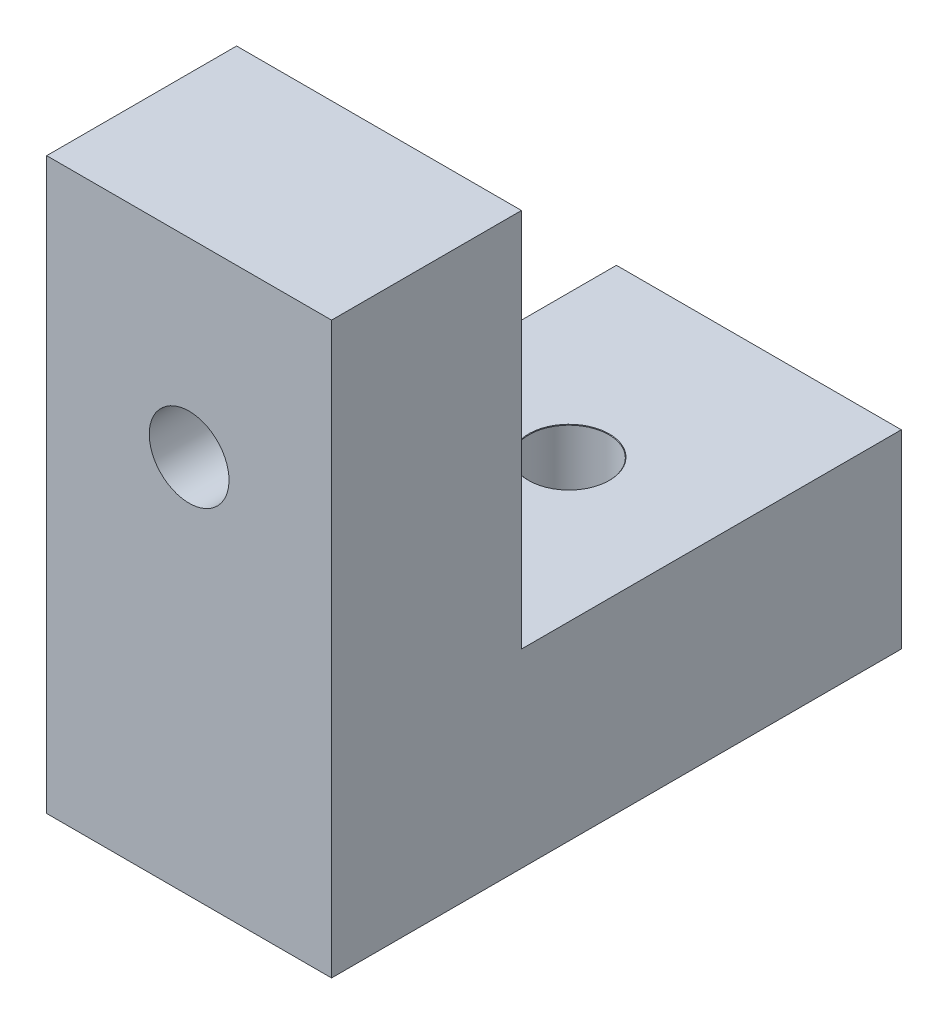
ISO-10303-21;
HEADER;
FILE_DESCRIPTION(('STEP AP214'),'2;1');
FILE_NAME('part.step','',(''),(''),'','','');
FILE_SCHEMA(('AUTOMOTIVE_DESIGN { 1 0 10303 214 1 1 1 1 }'));
ENDSEC;
DATA;
#1=APPLICATION_CONTEXT('core data for automotive mechanical design processes');
#2=APPLICATION_PROTOCOL_DEFINITION('international standard','automotive_design',2000,#1);
#3=PRODUCT_CONTEXT('',#1,'mechanical');
#4=PRODUCT('Part','Part','',(#3));
#5=PRODUCT_RELATED_PRODUCT_CATEGORY('part','',(#4));
#6=PRODUCT_DEFINITION_FORMATION('','',#4);
#7=PRODUCT_DEFINITION_CONTEXT('part definition',#1,'design');
#8=PRODUCT_DEFINITION('design','',#6,#7);
#9=PRODUCT_DEFINITION_SHAPE('','',#8);
#10=(LENGTH_UNIT() NAMED_UNIT(*) SI_UNIT(.MILLI.,.METRE.));
#11=(NAMED_UNIT(*) PLANE_ANGLE_UNIT() SI_UNIT($,.RADIAN.));
#12=(NAMED_UNIT(*) SI_UNIT($,.STERADIAN.) SOLID_ANGLE_UNIT());
#13=UNCERTAINTY_MEASURE_WITH_UNIT(LENGTH_MEASURE(1.E-05),#10,'distance_accuracy_value','');
#14=(GEOMETRIC_REPRESENTATION_CONTEXT(3) GLOBAL_UNCERTAINTY_ASSIGNED_CONTEXT((#13)) GLOBAL_UNIT_ASSIGNED_CONTEXT((#10,
#11,#12)) REPRESENTATION_CONTEXT('',''));
#15=CARTESIAN_POINT('',(0.,0.,0.));
#16=DIRECTION('',(0.,0.,1.));
#17=DIRECTION('',(1.,0.,0.));
#18=AXIS2_PLACEMENT_3D('',#15,#16,#17);
#19=CARTESIAN_POINT('',(15.,0.,-10.));
#20=DIRECTION('',(0.,0.,-1.));
#21=DIRECTION('',(0.,1.,0.));
#22=AXIS2_PLACEMENT_3D('',#19,#20,#21);
#23=PLANE('',#22);
#24=CARTESIAN_POINT('',(7.5,20.,-10.));
#25=DIRECTION('',(0.,0.,-1.));
#26=DIRECTION('',(0.,1.,0.));
#27=AXIS2_PLACEMENT_3D('',#24,#25,#26);
#28=CIRCLE('',#27,2.125);
#29=CARTESIAN_POINT('',(7.5,22.125,-10.));
#30=VERTEX_POINT('',#29);
#31=EDGE_CURVE('E189',#30,#30,#28,.T.);
#32=ORIENTED_EDGE('',*,*,#31,.F.);
#33=EDGE_LOOP('',(#32));
#34=FACE_BOUND('',#33,.T.);
#35=DIRECTION('',(0.,-1.,0.));
#36=VECTOR('',#35,1.);
#37=CARTESIAN_POINT('',(0.,0.,-10.));
#38=LINE('',#37,#36);
#39=CARTESIAN_POINT('',(0.,30.,-10.));
#40=VERTEX_POINT('',#39);
#41=CARTESIAN_POINT('',(0.,10.,-10.));
#42=VERTEX_POINT('',#41);
#43=EDGE_CURVE('E124',#40,#42,#38,.T.);
#44=ORIENTED_EDGE('',*,*,#43,.F.);
#45=DIRECTION('',(-1.,0.,0.));
#46=VECTOR('',#45,1.);
#47=CARTESIAN_POINT('',(15.,30.,-10.));
#48=LINE('',#47,#46);
#49=CARTESIAN_POINT('',(15.,30.,-10.));
#50=VERTEX_POINT('',#49);
#51=EDGE_CURVE('E11',#50,#40,#48,.T.);
#52=ORIENTED_EDGE('',*,*,#51,.F.);
#53=DIRECTION('',(0.,-1.,0.));
#54=VECTOR('',#53,1.);
#55=CARTESIAN_POINT('',(15.,0.,-10.));
#56=LINE('',#55,#54);
#57=CARTESIAN_POINT('',(15.,10.,-10.));
#58=VERTEX_POINT('',#57);
#59=EDGE_CURVE('E144',#50,#58,#56,.T.);
#60=ORIENTED_EDGE('',*,*,#59,.T.);
#61=DIRECTION('',(-1.,0.,0.));
#62=VECTOR('',#61,1.);
#63=CARTESIAN_POINT('',(15.,10.,-10.));
#64=LINE('',#63,#62);
#65=EDGE_CURVE('E85',#58,#42,#64,.T.);
#66=ORIENTED_EDGE('',*,*,#65,.T.);
#67=EDGE_LOOP('',(#44,#52,#60,#66));
#68=FACE_BOUND('',#67,.T.);
#69=ADVANCED_FACE('F39',(#34,#68),#23,.T.);
#70=CARTESIAN_POINT('',(15.,30.,0.));
#71=DIRECTION('',(0.,1.,0.));
#72=DIRECTION('',(0.,0.,1.));
#73=AXIS2_PLACEMENT_3D('',#70,#71,#72);
#74=PLANE('',#73);
#75=DIRECTION('',(0.,0.,-1.));
#76=VECTOR('',#75,1.);
#77=CARTESIAN_POINT('',(0.,30.,0.));
#78=LINE('',#77,#76);
#79=CARTESIAN_POINT('',(0.,30.,0.));
#80=VERTEX_POINT('',#79);
#81=EDGE_CURVE('E128',#80,#40,#78,.T.);
#82=ORIENTED_EDGE('',*,*,#81,.F.);
#83=DIRECTION('',(-1.,0.,0.));
#84=VECTOR('',#83,1.);
#85=CARTESIAN_POINT('',(15.,30.,0.));
#86=LINE('',#85,#84);
#87=CARTESIAN_POINT('',(15.,30.,0.));
#88=VERTEX_POINT('',#87);
#89=EDGE_CURVE('E48',#88,#80,#86,.T.);
#90=ORIENTED_EDGE('',*,*,#89,.F.);
#91=DIRECTION('',(0.,0.,-1.));
#92=VECTOR('',#91,1.);
#93=CARTESIAN_POINT('',(15.,30.,0.));
#94=LINE('',#93,#92);
#95=EDGE_CURVE('E164',#88,#50,#94,.T.);
#96=ORIENTED_EDGE('',*,*,#95,.T.);
#97=ORIENTED_EDGE('',*,*,#51,.T.);
#98=EDGE_LOOP('',(#82,#90,#96,#97));
#99=FACE_BOUND('',#98,.T.);
#100=ADVANCED_FACE('F157',(#99),#74,.T.);
#101=CARTESIAN_POINT('',(15.,0.,0.));
#102=DIRECTION('',(0.,0.,1.));
#103=DIRECTION('',(1.,0.,0.));
#104=AXIS2_PLACEMENT_3D('',#101,#102,#103);
#105=PLANE('',#104);
#106=CARTESIAN_POINT('',(7.5,20.,0.));
#107=DIRECTION('',(0.,0.,-1.));
#108=DIRECTION('',(0.,1.,0.));
#109=AXIS2_PLACEMENT_3D('',#106,#107,#108);
#110=CIRCLE('',#109,2.1);
#111=CARTESIAN_POINT('',(7.5,22.1,0.));
#112=VERTEX_POINT('',#111);
#113=EDGE_CURVE('E181',#112,#112,#110,.T.);
#114=ORIENTED_EDGE('',*,*,#113,.T.);
#115=EDGE_LOOP('',(#114));
#116=FACE_BOUND('',#115,.T.);
#117=DIRECTION('',(0.,1.,0.));
#118=VECTOR('',#117,1.);
#119=CARTESIAN_POINT('',(0.,0.,0.));
#120=LINE('',#119,#118);
#121=CARTESIAN_POINT('',(0.,0.,0.));
#122=VERTEX_POINT('',#121);
#123=EDGE_CURVE('E133',#122,#80,#120,.T.);
#124=ORIENTED_EDGE('',*,*,#123,.F.);
#125=DIRECTION('',(-1.,0.,0.));
#126=VECTOR('',#125,1.);
#127=CARTESIAN_POINT('',(15.,0.,0.));
#128=LINE('',#127,#126);
#129=CARTESIAN_POINT('',(15.,0.,0.));
#130=VERTEX_POINT('',#129);
#131=EDGE_CURVE('E114',#130,#122,#128,.T.);
#132=ORIENTED_EDGE('',*,*,#131,.F.);
#133=DIRECTION('',(0.,1.,0.));
#134=VECTOR('',#133,1.);
#135=CARTESIAN_POINT('',(15.,0.,0.));
#136=LINE('',#135,#134);
#137=EDGE_CURVE('E105',#130,#88,#136,.T.);
#138=ORIENTED_EDGE('',*,*,#137,.T.);
#139=ORIENTED_EDGE('',*,*,#89,.T.);
#140=EDGE_LOOP('',(#124,#132,#138,#139));
#141=FACE_BOUND('',#140,.T.);
#142=ADVANCED_FACE('F154',(#116,#141),#105,.T.);
#143=CARTESIAN_POINT('',(15.,0.,0.));
#144=DIRECTION('',(0.,1.,0.));
#145=DIRECTION('',(0.,0.,1.));
#146=AXIS2_PLACEMENT_3D('',#143,#144,#145);
#147=PLANE('',#146);
#148=CARTESIAN_POINT('',(7.5,0.,-20.));
#149=DIRECTION('',(0.,1.,0.));
#150=DIRECTION('',(0.,0.,1.));
#151=AXIS2_PLACEMENT_3D('',#148,#149,#150);
#152=CIRCLE('',#151,2.1);
#153=CARTESIAN_POINT('',(7.5,0.,-17.9));
#154=VERTEX_POINT('',#153);
#155=EDGE_CURVE('E129',#154,#154,#152,.T.);
#156=ORIENTED_EDGE('',*,*,#155,.T.);
#157=EDGE_LOOP('',(#156));
#158=FACE_BOUND('',#157,.T.);
#159=DIRECTION('',(0.,0.,-1.));
#160=VECTOR('',#159,1.);
#161=CARTESIAN_POINT('',(0.,0.,0.));
#162=LINE('',#161,#160);
#163=CARTESIAN_POINT('',(0.,0.,-30.));
#164=VERTEX_POINT('',#163);
#165=EDGE_CURVE('E112',#122,#164,#162,.T.);
#166=ORIENTED_EDGE('',*,*,#165,.T.);
#167=DIRECTION('',(-1.,0.,0.));
#168=VECTOR('',#167,1.);
#169=CARTESIAN_POINT('',(15.,0.,-30.));
#170=LINE('',#169,#168);
#171=CARTESIAN_POINT('',(15.,0.,-30.));
#172=VERTEX_POINT('',#171);
#173=EDGE_CURVE('E109',#172,#164,#170,.T.);
#174=ORIENTED_EDGE('',*,*,#173,.F.);
#175=DIRECTION('',(0.,0.,-1.));
#176=VECTOR('',#175,1.);
#177=CARTESIAN_POINT('',(15.,0.,0.));
#178=LINE('',#177,#176);
#179=EDGE_CURVE('E98',#130,#172,#178,.T.);
#180=ORIENTED_EDGE('',*,*,#179,.F.);
#181=ORIENTED_EDGE('',*,*,#131,.T.);
#182=EDGE_LOOP('',(#166,#174,#180,#181));
#183=FACE_BOUND('',#182,.T.);
#184=ADVANCED_FACE('F110',(#158,#183),#147,.F.);
#185=CARTESIAN_POINT('',(15.,0.,-30.));
#186=DIRECTION('',(0.,0.,1.));
#187=DIRECTION('',(1.,0.,0.));
#188=AXIS2_PLACEMENT_3D('',#185,#186,#187);
#189=PLANE('',#188);
#190=DIRECTION('',(0.,1.,0.));
#191=VECTOR('',#190,1.);
#192=CARTESIAN_POINT('',(0.,0.,-30.));
#193=LINE('',#192,#191);
#194=CARTESIAN_POINT('',(0.,10.,-30.));
#195=VERTEX_POINT('',#194);
#196=EDGE_CURVE('E78',#164,#195,#193,.T.);
#197=ORIENTED_EDGE('',*,*,#196,.T.);
#198=DIRECTION('',(-1.,0.,0.));
#199=VECTOR('',#198,1.);
#200=CARTESIAN_POINT('',(15.,10.,-30.));
#201=LINE('',#200,#199);
#202=CARTESIAN_POINT('',(15.,10.,-30.));
#203=VERTEX_POINT('',#202);
#204=EDGE_CURVE('E115',#203,#195,#201,.T.);
#205=ORIENTED_EDGE('',*,*,#204,.F.);
#206=DIRECTION('',(0.,1.,0.));
#207=VECTOR('',#206,1.);
#208=CARTESIAN_POINT('',(15.,0.,-30.));
#209=LINE('',#208,#207);
#210=EDGE_CURVE('E102',#172,#203,#209,.T.);
#211=ORIENTED_EDGE('',*,*,#210,.F.);
#212=ORIENTED_EDGE('',*,*,#173,.T.);
#213=EDGE_LOOP('',(#197,#205,#211,#212));
#214=FACE_BOUND('',#213,.T.);
#215=ADVANCED_FACE('F117',(#214),#189,.F.);
#216=CARTESIAN_POINT('',(15.,10.,0.));
#217=DIRECTION('',(0.,-1.,0.));
#218=DIRECTION('',(0.,0.,-1.));
#219=AXIS2_PLACEMENT_3D('',#216,#217,#218);
#220=PLANE('',#219);
#221=CARTESIAN_POINT('',(7.5,10.,-20.));
#222=DIRECTION('',(0.,1.,0.));
#223=DIRECTION('',(0.,0.,1.));
#224=AXIS2_PLACEMENT_3D('',#221,#222,#223);
#225=CIRCLE('',#224,2.125);
#226=CARTESIAN_POINT('',(7.5,10.,-17.875));
#227=VERTEX_POINT('',#226);
#228=EDGE_CURVE('E177',#227,#227,#225,.T.);
#229=ORIENTED_EDGE('',*,*,#228,.F.);
#230=EDGE_LOOP('',(#229));
#231=FACE_BOUND('',#230,.T.);
#232=DIRECTION('',(0.,0.,1.));
#233=VECTOR('',#232,1.);
#234=CARTESIAN_POINT('',(0.,10.,0.));
#235=LINE('',#234,#233);
#236=EDGE_CURVE('E141',#195,#42,#235,.T.);
#237=ORIENTED_EDGE('',*,*,#236,.T.);
#238=ORIENTED_EDGE('',*,*,#65,.F.);
#239=DIRECTION('',(0.,0.,1.));
#240=VECTOR('',#239,1.);
#241=CARTESIAN_POINT('',(15.,10.,0.));
#242=LINE('',#241,#240);
#243=EDGE_CURVE('E56',#203,#58,#242,.T.);
#244=ORIENTED_EDGE('',*,*,#243,.F.);
#245=ORIENTED_EDGE('',*,*,#204,.T.);
#246=EDGE_LOOP('',(#237,#238,#244,#245));
#247=FACE_BOUND('',#246,.T.);
#248=ADVANCED_FACE('F162',(#231,#247),#220,.F.);
#249=CARTESIAN_POINT('',(15.,0.,0.));
#250=DIRECTION('',(1.,0.,0.));
#251=DIRECTION('',(0.,0.,-1.));
#252=AXIS2_PLACEMENT_3D('',#249,#250,#251);
#253=PLANE('',#252);
#254=ORIENTED_EDGE('',*,*,#59,.F.);
#255=ORIENTED_EDGE('',*,*,#95,.F.);
#256=ORIENTED_EDGE('',*,*,#137,.F.);
#257=ORIENTED_EDGE('',*,*,#179,.T.);
#258=ORIENTED_EDGE('',*,*,#210,.T.);
#259=ORIENTED_EDGE('',*,*,#243,.T.);
#260=EDGE_LOOP('',(#254,#255,#256,#257,#258,#259));
#261=FACE_BOUND('',#260,.T.);
#262=ADVANCED_FACE('F100',(#261),#253,.T.);
#263=CARTESIAN_POINT('',(0.,0.,0.));
#264=DIRECTION('',(1.,0.,0.));
#265=DIRECTION('',(0.,0.,-1.));
#266=AXIS2_PLACEMENT_3D('',#263,#264,#265);
#267=PLANE('',#266);
#268=ORIENTED_EDGE('',*,*,#43,.T.);
#269=ORIENTED_EDGE('',*,*,#236,.F.);
#270=ORIENTED_EDGE('',*,*,#196,.F.);
#271=ORIENTED_EDGE('',*,*,#165,.F.);
#272=ORIENTED_EDGE('',*,*,#123,.T.);
#273=ORIENTED_EDGE('',*,*,#81,.T.);
#274=EDGE_LOOP('',(#268,#269,#270,#271,#272,#273));
#275=FACE_BOUND('',#274,.T.);
#276=ADVANCED_FACE('F159',(#275),#267,.F.);
#277=CARTESIAN_POINT('',(7.5,10.,-20.));
#278=DIRECTION('',(0.,1.,0.));
#279=DIRECTION('',(0.,0.,1.));
#280=AXIS2_PLACEMENT_3D('',#277,#278,#279);
#281=CYLINDRICAL_SURFACE('',#280,2.1);
#282=ORIENTED_EDGE('',*,*,#155,.F.);
#283=EDGE_LOOP('',(#282));
#284=FACE_BOUND('',#283,.T.);
#285=CARTESIAN_POINT('',(7.5,9.975,-20.));
#286=DIRECTION('',(0.,1.,0.));
#287=DIRECTION('',(0.,0.,1.));
#288=AXIS2_PLACEMENT_3D('',#285,#286,#287);
#289=CIRCLE('',#288,2.1);
#290=CARTESIAN_POINT('',(7.5,9.975,-17.9));
#291=VERTEX_POINT('',#290);
#292=EDGE_CURVE('E173',#291,#291,#289,.T.);
#293=ORIENTED_EDGE('',*,*,#292,.T.);
#294=EDGE_LOOP('',(#293));
#295=FACE_BOUND('',#294,.T.);
#296=ADVANCED_FACE('F216',(#284,#295),#281,.F.);
#297=CARTESIAN_POINT('',(7.5,10.,-20.));
#298=DIRECTION('',(0.,1.,0.));
#299=DIRECTION('',(0.,0.,1.));
#300=AXIS2_PLACEMENT_3D('',#297,#298,#299);
#301=CONICAL_SURFACE('',#300,2.125,0.785398163397379);
#302=ORIENTED_EDGE('',*,*,#292,.F.);
#303=EDGE_LOOP('',(#302));
#304=FACE_BOUND('',#303,.T.);
#305=ORIENTED_EDGE('',*,*,#228,.T.);
#306=EDGE_LOOP('',(#305));
#307=FACE_BOUND('',#306,.T.);
#308=ADVANCED_FACE('F221',(#304,#307),#301,.F.);
#309=CARTESIAN_POINT('',(7.5,20.,-10.));
#310=DIRECTION('',(0.,0.,-1.));
#311=DIRECTION('',(0.,1.,0.));
#312=AXIS2_PLACEMENT_3D('',#309,#310,#311);
#313=CYLINDRICAL_SURFACE('',#312,2.1);
#314=ORIENTED_EDGE('',*,*,#113,.F.);
#315=EDGE_LOOP('',(#314));
#316=FACE_BOUND('',#315,.T.);
#317=CARTESIAN_POINT('',(7.5,20.,-9.975));
#318=DIRECTION('',(0.,0.,-1.));
#319=DIRECTION('',(0.,1.,0.));
#320=AXIS2_PLACEMENT_3D('',#317,#318,#319);
#321=CIRCLE('',#320,2.1);
#322=CARTESIAN_POINT('',(7.5,22.1,-9.975));
#323=VERTEX_POINT('',#322);
#324=EDGE_CURVE('E185',#323,#323,#321,.T.);
#325=ORIENTED_EDGE('',*,*,#324,.T.);
#326=EDGE_LOOP('',(#325));
#327=FACE_BOUND('',#326,.T.);
#328=ADVANCED_FACE('F225',(#316,#327),#313,.F.);
#329=CARTESIAN_POINT('',(7.5,20.,-10.));
#330=DIRECTION('',(0.,0.,-1.));
#331=DIRECTION('',(0.,1.,0.));
#332=AXIS2_PLACEMENT_3D('',#329,#330,#331);
#333=CONICAL_SURFACE('',#332,2.125,0.785398163397379);
#334=ORIENTED_EDGE('',*,*,#324,.F.);
#335=EDGE_LOOP('',(#334));
#336=FACE_BOUND('',#335,.T.);
#337=ORIENTED_EDGE('',*,*,#31,.T.);
#338=EDGE_LOOP('',(#337));
#339=FACE_BOUND('',#338,.T.);
#340=ADVANCED_FACE('F194',(#336,#339),#333,.F.);
#341=CLOSED_SHELL('',(#69,#100,#142,#184,#215,#248,#262,#276,#296,#308,#328,#340));
#342=MANIFOLD_SOLID_BREP('B2',#341);
#343=ADVANCED_BREP_SHAPE_REPRESENTATION('',(#18,#342),#14);
#344=SHAPE_DEFINITION_REPRESENTATION(#9,#343);
ENDSEC;
END-ISO-10303-21;
